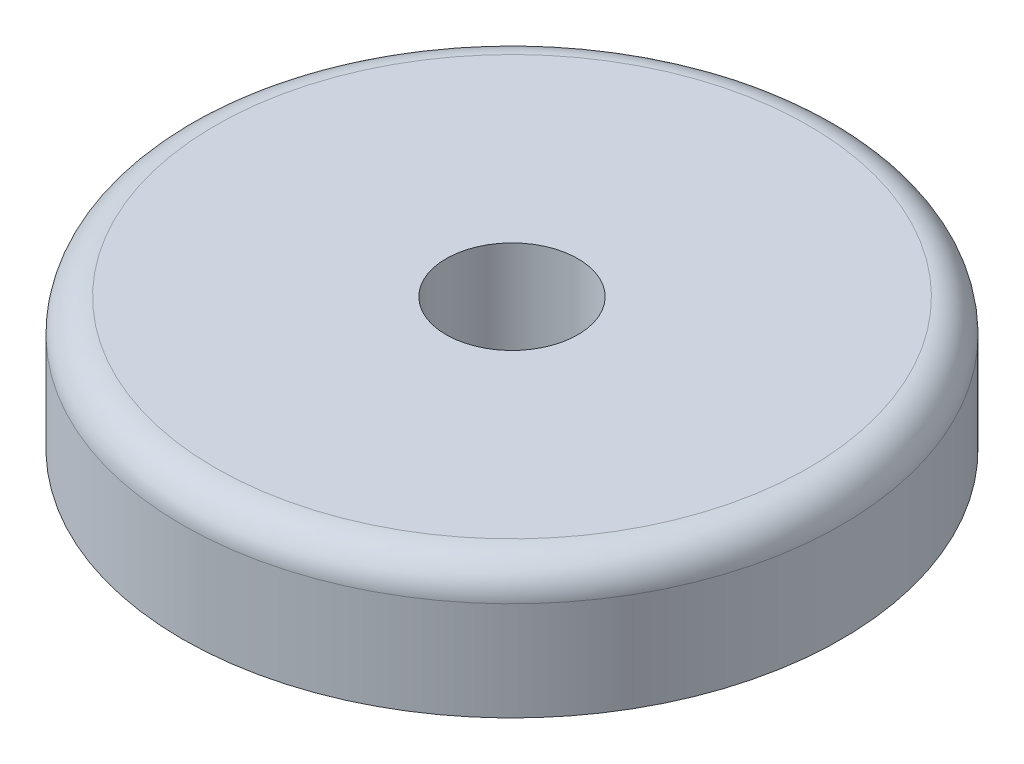
ISO-10303-21;
HEADER;
FILE_DESCRIPTION(('STEP AP214'),'2;1');
FILE_NAME('part.step','',(''),(''),'','','');
FILE_SCHEMA(('AUTOMOTIVE_DESIGN { 1 0 10303 214 1 1 1 1 }'));
ENDSEC;
DATA;
#1=APPLICATION_CONTEXT('core data for automotive mechanical design processes');
#2=APPLICATION_PROTOCOL_DEFINITION('international standard','automotive_design',2000,#1);
#3=PRODUCT_CONTEXT('',#1,'mechanical');
#4=PRODUCT('Part','Part','',(#3));
#5=PRODUCT_RELATED_PRODUCT_CATEGORY('part','',(#4));
#6=PRODUCT_DEFINITION_FORMATION('','',#4);
#7=PRODUCT_DEFINITION_CONTEXT('part definition',#1,'design');
#8=PRODUCT_DEFINITION('design','',#6,#7);
#9=PRODUCT_DEFINITION_SHAPE('','',#8);
#10=(LENGTH_UNIT() NAMED_UNIT(*) SI_UNIT(.MILLI.,.METRE.));
#11=(NAMED_UNIT(*) PLANE_ANGLE_UNIT() SI_UNIT($,.RADIAN.));
#12=(NAMED_UNIT(*) SI_UNIT($,.STERADIAN.) SOLID_ANGLE_UNIT());
#13=UNCERTAINTY_MEASURE_WITH_UNIT(LENGTH_MEASURE(1.E-05),#10,'distance_accuracy_value','');
#14=(GEOMETRIC_REPRESENTATION_CONTEXT(3) GLOBAL_UNCERTAINTY_ASSIGNED_CONTEXT((#13)) GLOBAL_UNIT_ASSIGNED_CONTEXT((#10,
#11,#12)) REPRESENTATION_CONTEXT('',''));
#15=CARTESIAN_POINT('',(0.,0.,0.));
#16=DIRECTION('',(0.,0.,1.));
#17=DIRECTION('',(1.,0.,0.));
#18=AXIS2_PLACEMENT_3D('',#15,#16,#17);
#19=CARTESIAN_POINT('',(0.,2.,0.));
#20=DIRECTION('',(0.,-1.,0.));
#21=DIRECTION('',(0.,0.,-1.));
#22=AXIS2_PLACEMENT_3D('',#19,#20,#21);
#23=CYLINDRICAL_SURFACE('',#22,5.);
#24=CARTESIAN_POINT('',(0.,1.5,0.));
#25=DIRECTION('',(0.,1.,0.));
#26=DIRECTION('',(0.,0.,1.));
#27=AXIS2_PLACEMENT_3D('',#24,#25,#26);
#28=CIRCLE('',#27,5.);
#29=CARTESIAN_POINT('',(0.,1.5,5.));
#30=VERTEX_POINT('',#29);
#31=EDGE_CURVE('E10',#30,#30,#28,.F.);
#32=ORIENTED_EDGE('',*,*,#31,.T.);
#33=EDGE_LOOP('',(#32));
#34=FACE_BOUND('',#33,.T.);
#35=CARTESIAN_POINT('',(0.,0.,0.));
#36=DIRECTION('',(0.,1.,0.));
#37=DIRECTION('',(0.,0.,1.));
#38=AXIS2_PLACEMENT_3D('',#35,#36,#37);
#39=CIRCLE('',#38,5.);
#40=CARTESIAN_POINT('',(0.,0.,5.));
#41=VERTEX_POINT('',#40);
#42=EDGE_CURVE('E54',#41,#41,#39,.T.);
#43=ORIENTED_EDGE('',*,*,#42,.T.);
#44=EDGE_LOOP('',(#43));
#45=FACE_BOUND('',#44,.T.);
#46=ADVANCED_FACE('F40',(#34,#45),#23,.T.);
#47=CARTESIAN_POINT('',(0.,2.,0.));
#48=DIRECTION('',(0.,1.,0.));
#49=DIRECTION('',(0.,0.,1.));
#50=AXIS2_PLACEMENT_3D('',#47,#48,#49);
#51=PLANE('',#50);
#52=CARTESIAN_POINT('',(0.,2.,0.));
#53=DIRECTION('',(0.,1.,0.));
#54=DIRECTION('',(0.,0.,1.));
#55=AXIS2_PLACEMENT_3D('',#52,#53,#54);
#56=CIRCLE('',#55,4.5);
#57=CARTESIAN_POINT('',(0.,2.,4.5));
#58=VERTEX_POINT('',#57);
#59=EDGE_CURVE('E48',#58,#58,#56,.T.);
#60=ORIENTED_EDGE('',*,*,#59,.T.);
#61=EDGE_LOOP('',(#60));
#62=FACE_BOUND('',#61,.T.);
#63=CARTESIAN_POINT('',(0.,2.,0.));
#64=DIRECTION('',(0.,1.,0.));
#65=DIRECTION('',(0.,0.,1.));
#66=AXIS2_PLACEMENT_3D('',#63,#64,#65);
#67=CIRCLE('',#66,1.);
#68=CARTESIAN_POINT('',(0.,2.,1.));
#69=VERTEX_POINT('',#68);
#70=EDGE_CURVE('E64',#69,#69,#67,.T.);
#71=ORIENTED_EDGE('',*,*,#70,.F.);
#72=EDGE_LOOP('',(#71));
#73=FACE_BOUND('',#72,.T.);
#74=ADVANCED_FACE('F72',(#62,#73),#51,.T.);
#75=CARTESIAN_POINT('',(0.,0.,0.));
#76=DIRECTION('',(0.,1.,0.));
#77=DIRECTION('',(0.,0.,1.));
#78=AXIS2_PLACEMENT_3D('',#75,#76,#77);
#79=PLANE('',#78);
#80=CARTESIAN_POINT('',(0.,0.,0.));
#81=DIRECTION('',(0.,1.,0.));
#82=DIRECTION('',(0.,0.,1.));
#83=AXIS2_PLACEMENT_3D('',#80,#81,#82);
#84=CIRCLE('',#83,1.);
#85=CARTESIAN_POINT('',(0.,0.,1.));
#86=VERTEX_POINT('',#85);
#87=EDGE_CURVE('E60',#86,#86,#84,.T.);
#88=ORIENTED_EDGE('',*,*,#87,.T.);
#89=EDGE_LOOP('',(#88));
#90=FACE_BOUND('',#89,.T.);
#91=ORIENTED_EDGE('',*,*,#42,.F.);
#92=EDGE_LOOP('',(#91));
#93=FACE_BOUND('',#92,.T.);
#94=ADVANCED_FACE('F74',(#90,#93),#79,.F.);
#95=CARTESIAN_POINT('',(0.,-10.5,0.));
#96=DIRECTION('',(0.,1.,0.));
#97=DIRECTION('',(0.,0.,1.));
#98=AXIS2_PLACEMENT_3D('',#95,#96,#97);
#99=CYLINDRICAL_SURFACE('',#98,1.);
#100=ORIENTED_EDGE('',*,*,#70,.T.);
#101=EDGE_LOOP('',(#100));
#102=FACE_BOUND('',#101,.T.);
#103=ORIENTED_EDGE('',*,*,#87,.F.);
#104=EDGE_LOOP('',(#103));
#105=FACE_BOUND('',#104,.T.);
#106=ADVANCED_FACE('F69',(#102,#105),#99,.F.);
#107=CARTESIAN_POINT('',(0.,1.5,0.));
#108=DIRECTION('',(0.,1.,0.));
#109=DIRECTION('',(0.,0.,1.));
#110=AXIS2_PLACEMENT_3D('',#107,#108,#109);
#111=TOROIDAL_SURFACE('',#110,4.5,0.5);
#112=ORIENTED_EDGE('',*,*,#31,.F.);
#113=EDGE_LOOP('',(#112));
#114=FACE_BOUND('',#113,.T.);
#115=ORIENTED_EDGE('',*,*,#59,.F.);
#116=EDGE_LOOP('',(#115));
#117=FACE_BOUND('',#116,.T.);
#118=ADVANCED_FACE('F42',(#114,#117),#111,.T.);
#119=CLOSED_SHELL('',(#46,#74,#94,#106,#118));
#120=MANIFOLD_SOLID_BREP('B2',#119);
#121=ADVANCED_BREP_SHAPE_REPRESENTATION('',(#18,#120),#14);
#122=SHAPE_DEFINITION_REPRESENTATION(#9,#121);
ENDSEC;
END-ISO-10303-21;
